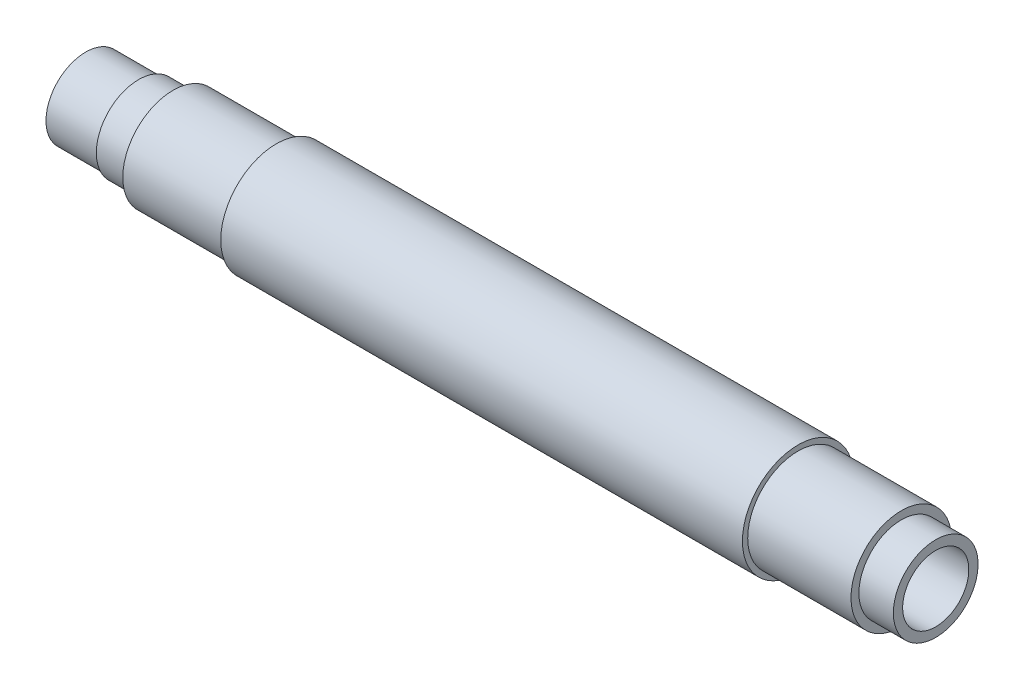
ISO-10303-21;
HEADER;
FILE_DESCRIPTION(('STEP AP214'),'2;1');
FILE_NAME('part.step','',(''),(''),'','','');
FILE_SCHEMA(('AUTOMOTIVE_DESIGN { 1 0 10303 214 1 1 1 1 }'));
ENDSEC;
DATA;
#1=APPLICATION_CONTEXT('core data for automotive mechanical design processes');
#2=APPLICATION_PROTOCOL_DEFINITION('international standard','automotive_design',2000,#1);
#3=PRODUCT_CONTEXT('',#1,'mechanical');
#4=PRODUCT('Part','Part','',(#3));
#5=PRODUCT_RELATED_PRODUCT_CATEGORY('part','',(#4));
#6=PRODUCT_DEFINITION_FORMATION('','',#4);
#7=PRODUCT_DEFINITION_CONTEXT('part definition',#1,'design');
#8=PRODUCT_DEFINITION('design','',#6,#7);
#9=PRODUCT_DEFINITION_SHAPE('','',#8);
#10=(LENGTH_UNIT() NAMED_UNIT(*) SI_UNIT(.MILLI.,.METRE.));
#11=(NAMED_UNIT(*) PLANE_ANGLE_UNIT() SI_UNIT($,.RADIAN.));
#12=(NAMED_UNIT(*) SI_UNIT($,.STERADIAN.) SOLID_ANGLE_UNIT());
#13=UNCERTAINTY_MEASURE_WITH_UNIT(LENGTH_MEASURE(1.E-05),#10,'distance_accuracy_value','');
#14=(GEOMETRIC_REPRESENTATION_CONTEXT(3) GLOBAL_UNCERTAINTY_ASSIGNED_CONTEXT((#13)) GLOBAL_UNIT_ASSIGNED_CONTEXT((#10,
#11,#12)) REPRESENTATION_CONTEXT('',''));
#15=CARTESIAN_POINT('',(0.,0.,0.));
#16=DIRECTION('',(0.,0.,1.));
#17=DIRECTION('',(1.,0.,0.));
#18=AXIS2_PLACEMENT_3D('',#15,#16,#17);
#19=CARTESIAN_POINT('',(0.,0.,0.));
#20=DIRECTION('',(-1.,0.,0.));
#21=DIRECTION('',(0.,0.,1.));
#22=AXIS2_PLACEMENT_3D('',#19,#20,#21);
#23=CYLINDRICAL_SURFACE('',#22,21.);
#24=CARTESIAN_POINT('',(-98.5,0.,0.));
#25=DIRECTION('',(-1.,0.,0.));
#26=DIRECTION('',(0.,0.,1.));
#27=AXIS2_PLACEMENT_3D('',#24,#25,#26);
#28=CIRCLE('',#27,21.);
#29=CARTESIAN_POINT('',(-98.5,0.,21.));
#30=VERTEX_POINT('',#29);
#31=EDGE_CURVE('E10',#30,#30,#28,.T.);
#32=ORIENTED_EDGE('',*,*,#31,.F.);
#33=EDGE_LOOP('',(#32));
#34=FACE_BOUND('',#33,.T.);
#35=CARTESIAN_POINT('',(98.5,0.,0.));
#36=DIRECTION('',(-1.,0.,0.));
#37=DIRECTION('',(0.,0.,1.));
#38=AXIS2_PLACEMENT_3D('',#35,#36,#37);
#39=CIRCLE('',#38,21.);
#40=CARTESIAN_POINT('',(98.5,0.,21.));
#41=VERTEX_POINT('',#40);
#42=EDGE_CURVE('E67',#41,#41,#39,.T.);
#43=ORIENTED_EDGE('',*,*,#42,.T.);
#44=EDGE_LOOP('',(#43));
#45=FACE_BOUND('',#44,.T.);
#46=ADVANCED_FACE('F36',(#34,#45),#23,.T.);
#47=CARTESIAN_POINT('',(-98.5,21.,0.));
#48=DIRECTION('',(1.,0.,0.));
#49=DIRECTION('',(0.,0.,-1.));
#50=AXIS2_PLACEMENT_3D('',#47,#48,#49);
#51=PLANE('',#50);
#52=CARTESIAN_POINT('',(-98.5,0.,0.));
#53=DIRECTION('',(-1.,0.,0.));
#54=DIRECTION('',(0.,0.,1.));
#55=AXIS2_PLACEMENT_3D('',#52,#53,#54);
#56=CIRCLE('',#55,19.);
#57=CARTESIAN_POINT('',(-98.5,0.,19.));
#58=VERTEX_POINT('',#57);
#59=EDGE_CURVE('E42',#58,#58,#56,.T.);
#60=ORIENTED_EDGE('',*,*,#59,.F.);
#61=EDGE_LOOP('',(#60));
#62=FACE_BOUND('',#61,.T.);
#63=ORIENTED_EDGE('',*,*,#31,.T.);
#64=EDGE_LOOP('',(#63));
#65=FACE_BOUND('',#64,.T.);
#66=ADVANCED_FACE('F102',(#62,#65),#51,.F.);
#67=CARTESIAN_POINT('',(0.,0.,0.));
#68=DIRECTION('',(-1.,0.,0.));
#69=DIRECTION('',(0.,0.,1.));
#70=AXIS2_PLACEMENT_3D('',#67,#68,#69);
#71=CYLINDRICAL_SURFACE('',#70,19.);
#72=CARTESIAN_POINT('',(-137.5,0.,0.));
#73=DIRECTION('',(-1.,0.,0.));
#74=DIRECTION('',(0.,0.,1.));
#75=AXIS2_PLACEMENT_3D('',#72,#73,#74);
#76=CIRCLE('',#75,19.);
#77=CARTESIAN_POINT('',(-137.5,0.,19.));
#78=VERTEX_POINT('',#77);
#79=EDGE_CURVE('E46',#78,#78,#76,.T.);
#80=ORIENTED_EDGE('',*,*,#79,.F.);
#81=EDGE_LOOP('',(#80));
#82=FACE_BOUND('',#81,.T.);
#83=ORIENTED_EDGE('',*,*,#59,.T.);
#84=EDGE_LOOP('',(#83));
#85=FACE_BOUND('',#84,.T.);
#86=ADVANCED_FACE('F107',(#82,#85),#71,.T.);
#87=CARTESIAN_POINT('',(-137.5,19.,0.));
#88=DIRECTION('',(1.,0.,0.));
#89=DIRECTION('',(0.,0.,-1.));
#90=AXIS2_PLACEMENT_3D('',#87,#88,#89);
#91=PLANE('',#90);
#92=CARTESIAN_POINT('',(-137.5,0.,0.));
#93=DIRECTION('',(-1.,0.,0.));
#94=DIRECTION('',(0.,0.,1.));
#95=AXIS2_PLACEMENT_3D('',#92,#93,#94);
#96=CIRCLE('',#95,16.);
#97=CARTESIAN_POINT('',(-137.5,0.,16.));
#98=VERTEX_POINT('',#97);
#99=EDGE_CURVE('E50',#98,#98,#96,.T.);
#100=ORIENTED_EDGE('',*,*,#99,.F.);
#101=EDGE_LOOP('',(#100));
#102=FACE_BOUND('',#101,.T.);
#103=ORIENTED_EDGE('',*,*,#79,.T.);
#104=EDGE_LOOP('',(#103));
#105=FACE_BOUND('',#104,.T.);
#106=ADVANCED_FACE('F141',(#102,#105),#91,.F.);
#107=CARTESIAN_POINT('',(0.,0.,0.));
#108=DIRECTION('',(-1.,0.,0.));
#109=DIRECTION('',(0.,0.,1.));
#110=AXIS2_PLACEMENT_3D('',#107,#108,#109);
#111=CYLINDRICAL_SURFACE('',#110,16.);
#112=CARTESIAN_POINT('',(-150.5,0.,0.));
#113=DIRECTION('',(-1.,0.,0.));
#114=DIRECTION('',(0.,0.,1.));
#115=AXIS2_PLACEMENT_3D('',#112,#113,#114);
#116=CIRCLE('',#115,16.);
#117=CARTESIAN_POINT('',(-150.5,0.,16.));
#118=VERTEX_POINT('',#117);
#119=EDGE_CURVE('E55',#118,#118,#116,.T.);
#120=ORIENTED_EDGE('',*,*,#119,.F.);
#121=EDGE_LOOP('',(#120));
#122=FACE_BOUND('',#121,.T.);
#123=ORIENTED_EDGE('',*,*,#99,.T.);
#124=EDGE_LOOP('',(#123));
#125=FACE_BOUND('',#124,.T.);
#126=ADVANCED_FACE('F137',(#122,#125),#111,.T.);
#127=CARTESIAN_POINT('',(-150.5,16.,0.));
#128=DIRECTION('',(1.,0.,0.));
#129=DIRECTION('',(0.,0.,-1.));
#130=AXIS2_PLACEMENT_3D('',#127,#128,#129);
#131=PLANE('',#130);
#132=CARTESIAN_POINT('',(-150.5,0.,0.));
#133=DIRECTION('',(-1.,0.,0.));
#134=DIRECTION('',(0.,0.,1.));
#135=AXIS2_PLACEMENT_3D('',#132,#133,#134);
#136=CIRCLE('',#135,15.);
#137=CARTESIAN_POINT('',(-150.5,0.,15.));
#138=VERTEX_POINT('',#137);
#139=EDGE_CURVE('E58',#138,#138,#136,.T.);
#140=ORIENTED_EDGE('',*,*,#139,.F.);
#141=EDGE_LOOP('',(#140));
#142=FACE_BOUND('',#141,.T.);
#143=ORIENTED_EDGE('',*,*,#119,.T.);
#144=EDGE_LOOP('',(#143));
#145=FACE_BOUND('',#144,.T.);
#146=ADVANCED_FACE('F133',(#142,#145),#131,.F.);
#147=CARTESIAN_POINT('',(0.,0.,0.));
#148=DIRECTION('',(-1.,0.,0.));
#149=DIRECTION('',(0.,0.,1.));
#150=AXIS2_PLACEMENT_3D('',#147,#148,#149);
#151=CYLINDRICAL_SURFACE('',#150,15.);
#152=CARTESIAN_POINT('',(-170.5,0.,0.));
#153=DIRECTION('',(-1.,0.,0.));
#154=DIRECTION('',(0.,0.,1.));
#155=AXIS2_PLACEMENT_3D('',#152,#153,#154);
#156=CIRCLE('',#155,15.);
#157=CARTESIAN_POINT('',(-170.5,0.,15.));
#158=VERTEX_POINT('',#157);
#159=EDGE_CURVE('E61',#158,#158,#156,.T.);
#160=ORIENTED_EDGE('',*,*,#159,.F.);
#161=EDGE_LOOP('',(#160));
#162=FACE_BOUND('',#161,.T.);
#163=ORIENTED_EDGE('',*,*,#139,.T.);
#164=EDGE_LOOP('',(#163));
#165=FACE_BOUND('',#164,.T.);
#166=ADVANCED_FACE('F129',(#162,#165),#151,.T.);
#167=CARTESIAN_POINT('',(-170.5,15.,0.));
#168=DIRECTION('',(1.,0.,0.));
#169=DIRECTION('',(0.,0.,-1.));
#170=AXIS2_PLACEMENT_3D('',#167,#168,#169);
#171=PLANE('',#170);
#172=CARTESIAN_POINT('',(-170.5,0.,0.));
#173=DIRECTION('',(-1.,0.,0.));
#174=DIRECTION('',(0.,0.,1.));
#175=AXIS2_PLACEMENT_3D('',#172,#173,#174);
#176=CIRCLE('',#175,12.5);
#177=CARTESIAN_POINT('',(-170.5,0.,12.5));
#178=VERTEX_POINT('',#177);
#179=EDGE_CURVE('E64',#178,#178,#176,.T.);
#180=ORIENTED_EDGE('',*,*,#179,.F.);
#181=EDGE_LOOP('',(#180));
#182=FACE_BOUND('',#181,.T.);
#183=ORIENTED_EDGE('',*,*,#159,.T.);
#184=EDGE_LOOP('',(#183));
#185=FACE_BOUND('',#184,.T.);
#186=ADVANCED_FACE('F123',(#182,#185),#171,.F.);
#187=CARTESIAN_POINT('',(0.,0.,0.));
#188=DIRECTION('',(-1.,0.,0.));
#189=DIRECTION('',(0.,0.,1.));
#190=AXIS2_PLACEMENT_3D('',#187,#188,#189);
#191=CYLINDRICAL_SURFACE('',#190,12.5);
#192=CARTESIAN_POINT('',(150.5,0.,0.));
#193=DIRECTION('',(-1.,0.,0.));
#194=DIRECTION('',(0.,0.,1.));
#195=AXIS2_PLACEMENT_3D('',#192,#193,#194);
#196=CIRCLE('',#195,12.5);
#197=CARTESIAN_POINT('',(150.5,0.,12.5));
#198=VERTEX_POINT('',#197);
#199=EDGE_CURVE('E82',#198,#198,#196,.F.);
#200=ORIENTED_EDGE('',*,*,#199,.T.);
#201=EDGE_LOOP('',(#200));
#202=FACE_BOUND('',#201,.T.);
#203=ORIENTED_EDGE('',*,*,#179,.T.);
#204=EDGE_LOOP('',(#203));
#205=FACE_BOUND('',#204,.T.);
#206=ADVANCED_FACE('F86',(#202,#205),#191,.F.);
#207=CARTESIAN_POINT('',(98.5,21.,0.));
#208=DIRECTION('',(-1.,0.,0.));
#209=DIRECTION('',(0.,0.,-1.));
#210=AXIS2_PLACEMENT_3D('',#207,#208,#209);
#211=PLANE('',#210);
#212=CARTESIAN_POINT('',(98.5,0.,0.));
#213=DIRECTION('',(-1.,0.,0.));
#214=DIRECTION('',(0.,0.,1.));
#215=AXIS2_PLACEMENT_3D('',#212,#213,#214);
#216=CIRCLE('',#215,19.);
#217=CARTESIAN_POINT('',(98.5,0.,19.));
#218=VERTEX_POINT('',#217);
#219=EDGE_CURVE('E70',#218,#218,#216,.T.);
#220=ORIENTED_EDGE('',*,*,#219,.T.);
#221=EDGE_LOOP('',(#220));
#222=FACE_BOUND('',#221,.T.);
#223=ORIENTED_EDGE('',*,*,#42,.F.);
#224=EDGE_LOOP('',(#223));
#225=FACE_BOUND('',#224,.T.);
#226=ADVANCED_FACE('F112',(#222,#225),#211,.F.);
#227=CARTESIAN_POINT('',(0.,0.,0.));
#228=DIRECTION('',(1.,0.,0.));
#229=DIRECTION('',(0.,0.,1.));
#230=AXIS2_PLACEMENT_3D('',#227,#228,#229);
#231=CYLINDRICAL_SURFACE('',#230,19.);
#232=CARTESIAN_POINT('',(137.5,0.,0.));
#233=DIRECTION('',(-1.,0.,0.));
#234=DIRECTION('',(0.,0.,1.));
#235=AXIS2_PLACEMENT_3D('',#232,#233,#234);
#236=CIRCLE('',#235,19.);
#237=CARTESIAN_POINT('',(137.5,0.,19.));
#238=VERTEX_POINT('',#237);
#239=EDGE_CURVE('E73',#238,#238,#236,.T.);
#240=ORIENTED_EDGE('',*,*,#239,.T.);
#241=EDGE_LOOP('',(#240));
#242=FACE_BOUND('',#241,.T.);
#243=ORIENTED_EDGE('',*,*,#219,.F.);
#244=EDGE_LOOP('',(#243));
#245=FACE_BOUND('',#244,.T.);
#246=ADVANCED_FACE('F114',(#242,#245),#231,.T.);
#247=CARTESIAN_POINT('',(137.5,19.,0.));
#248=DIRECTION('',(-1.,0.,0.));
#249=DIRECTION('',(0.,0.,-1.));
#250=AXIS2_PLACEMENT_3D('',#247,#248,#249);
#251=PLANE('',#250);
#252=CARTESIAN_POINT('',(137.5,0.,0.));
#253=DIRECTION('',(-1.,0.,0.));
#254=DIRECTION('',(0.,0.,1.));
#255=AXIS2_PLACEMENT_3D('',#252,#253,#254);
#256=CIRCLE('',#255,16.);
#257=CARTESIAN_POINT('',(137.5,0.,16.));
#258=VERTEX_POINT('',#257);
#259=EDGE_CURVE('E76',#258,#258,#256,.T.);
#260=ORIENTED_EDGE('',*,*,#259,.T.);
#261=EDGE_LOOP('',(#260));
#262=FACE_BOUND('',#261,.T.);
#263=ORIENTED_EDGE('',*,*,#239,.F.);
#264=EDGE_LOOP('',(#263));
#265=FACE_BOUND('',#264,.T.);
#266=ADVANCED_FACE('F97',(#262,#265),#251,.F.);
#267=CARTESIAN_POINT('',(0.,0.,0.));
#268=DIRECTION('',(1.,0.,0.));
#269=DIRECTION('',(0.,0.,1.));
#270=AXIS2_PLACEMENT_3D('',#267,#268,#269);
#271=CYLINDRICAL_SURFACE('',#270,16.);
#272=CARTESIAN_POINT('',(150.5,0.,0.));
#273=DIRECTION('',(-1.,0.,0.));
#274=DIRECTION('',(0.,0.,1.));
#275=AXIS2_PLACEMENT_3D('',#272,#273,#274);
#276=CIRCLE('',#275,16.);
#277=CARTESIAN_POINT('',(150.5,0.,16.));
#278=VERTEX_POINT('',#277);
#279=EDGE_CURVE('E79',#278,#278,#276,.T.);
#280=ORIENTED_EDGE('',*,*,#279,.T.);
#281=EDGE_LOOP('',(#280));
#282=FACE_BOUND('',#281,.T.);
#283=ORIENTED_EDGE('',*,*,#259,.F.);
#284=EDGE_LOOP('',(#283));
#285=FACE_BOUND('',#284,.T.);
#286=ADVANCED_FACE('F91',(#282,#285),#271,.T.);
#287=CARTESIAN_POINT('',(150.5,16.,0.));
#288=DIRECTION('',(-1.,0.,0.));
#289=DIRECTION('',(0.,0.,-1.));
#290=AXIS2_PLACEMENT_3D('',#287,#288,#289);
#291=PLANE('',#290);
#292=ORIENTED_EDGE('',*,*,#279,.F.);
#293=EDGE_LOOP('',(#292));
#294=FACE_BOUND('',#293,.T.);
#295=ORIENTED_EDGE('',*,*,#199,.F.);
#296=EDGE_LOOP('',(#295));
#297=FACE_BOUND('',#296,.T.);
#298=ADVANCED_FACE('F89',(#294,#297),#291,.F.);
#299=CLOSED_SHELL('',(#46,#66,#86,#106,#126,#146,#166,#186,#206,#226,#246,#266,#286,#298));
#300=MANIFOLD_SOLID_BREP('B2',#299);
#301=ADVANCED_BREP_SHAPE_REPRESENTATION('',(#18,#300),#14);
#302=SHAPE_DEFINITION_REPRESENTATION(#9,#301);
ENDSEC;
END-ISO-10303-21;
